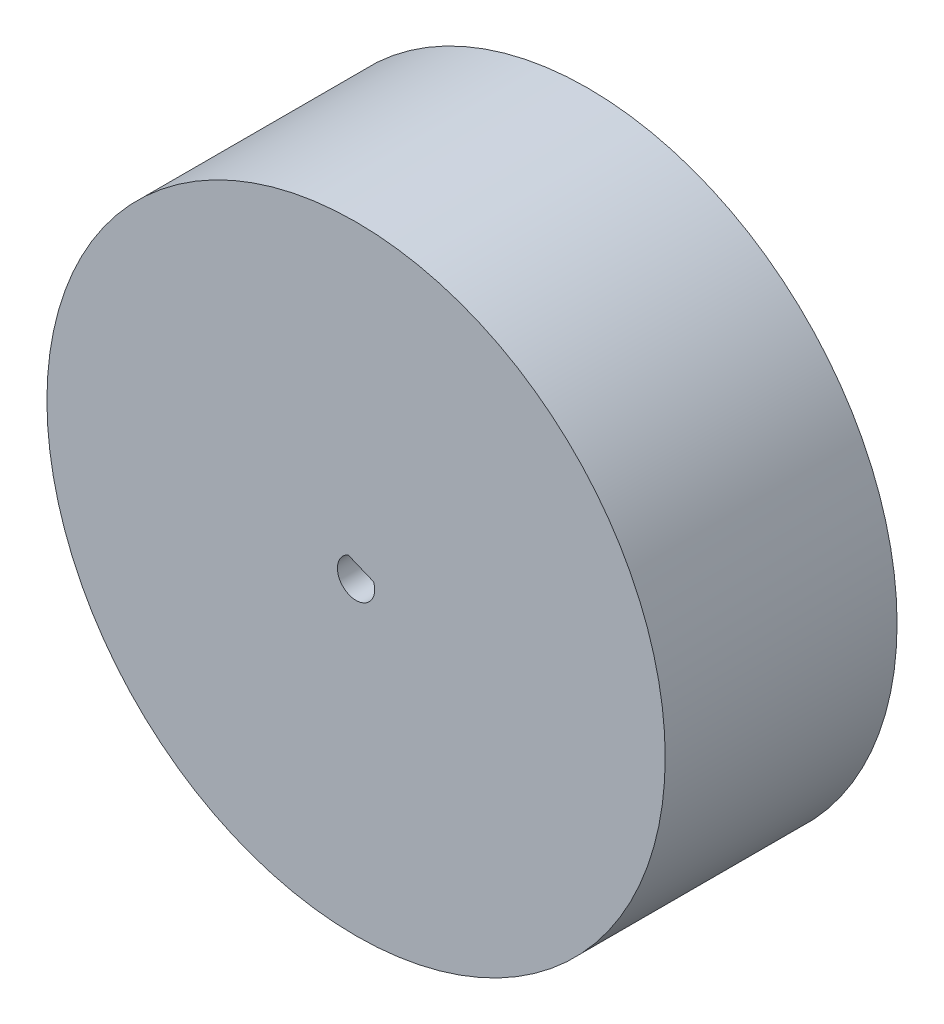
ISO-10303-21;
HEADER;
FILE_DESCRIPTION(('STEP AP214'),'2;1');
FILE_NAME('part.step','',(''),(''),'','','');
FILE_SCHEMA(('AUTOMOTIVE_DESIGN { 1 0 10303 214 1 1 1 1 }'));
ENDSEC;
DATA;
#1=APPLICATION_CONTEXT('core data for automotive mechanical design processes');
#2=APPLICATION_PROTOCOL_DEFINITION('international standard','automotive_design',2000,#1);
#3=PRODUCT_CONTEXT('',#1,'mechanical');
#4=PRODUCT('Part','Part','',(#3));
#5=PRODUCT_RELATED_PRODUCT_CATEGORY('part','',(#4));
#6=PRODUCT_DEFINITION_FORMATION('','',#4);
#7=PRODUCT_DEFINITION_CONTEXT('part definition',#1,'design');
#8=PRODUCT_DEFINITION('design','',#6,#7);
#9=PRODUCT_DEFINITION_SHAPE('','',#8);
#10=(LENGTH_UNIT() NAMED_UNIT(*) SI_UNIT(.MILLI.,.METRE.));
#11=(NAMED_UNIT(*) PLANE_ANGLE_UNIT() SI_UNIT($,.RADIAN.));
#12=(NAMED_UNIT(*) SI_UNIT($,.STERADIAN.) SOLID_ANGLE_UNIT());
#13=UNCERTAINTY_MEASURE_WITH_UNIT(LENGTH_MEASURE(1.E-05),#10,'distance_accuracy_value','');
#14=(GEOMETRIC_REPRESENTATION_CONTEXT(3) GLOBAL_UNCERTAINTY_ASSIGNED_CONTEXT((#13)) GLOBAL_UNIT_ASSIGNED_CONTEXT((#10,
#11,#12)) REPRESENTATION_CONTEXT('',''));
#15=CARTESIAN_POINT('',(0.,0.,0.));
#16=DIRECTION('',(0.,0.,1.));
#17=DIRECTION('',(1.,0.,0.));
#18=AXIS2_PLACEMENT_3D('',#15,#16,#17);
#19=CARTESIAN_POINT('',(0.,0.,-9.525));
#20=DIRECTION('',(0.,0.,1.));
#21=DIRECTION('',(1.,0.,0.));
#22=AXIS2_PLACEMENT_3D('',#19,#20,#21);
#23=CYLINDRICAL_SURFACE('',#22,25.4);
#24=CARTESIAN_POINT('',(0.,0.,-9.525));
#25=DIRECTION('',(0.,0.,1.));
#26=DIRECTION('',(1.,0.,0.));
#27=AXIS2_PLACEMENT_3D('',#24,#25,#26);
#28=CIRCLE('',#27,25.4);
#29=CARTESIAN_POINT('',(25.4,0.,-9.525));
#30=VERTEX_POINT('',#29);
#31=EDGE_CURVE('E11',#30,#30,#28,.T.);
#32=CARTESIAN_POINT('',(0.,0.,9.525));
#33=DIRECTION('',(0.,0.,1.));
#34=DIRECTION('',(1.,0.,0.));
#35=AXIS2_PLACEMENT_3D('',#32,#33,#34);
#36=CIRCLE('',#35,25.4);
#37=CARTESIAN_POINT('',(25.4,0.,9.525));
#38=VERTEX_POINT('',#37);
#39=EDGE_CURVE('E42',#38,#38,#36,.T.);
#40=CARTESIAN_POINT('',(25.4,0.,-9.525));
#41=CARTESIAN_POINT('',(25.4,0.,-9.3265625));
#42=CARTESIAN_POINT('',(25.4,0.,-9.128125));
#43=CARTESIAN_POINT('',(25.4,0.,-8.73125));
#44=CARTESIAN_POINT('',(25.4,0.,-8.5328125));
#45=CARTESIAN_POINT('',(25.4,0.,-8.1359375));
#46=CARTESIAN_POINT('',(25.4,0.,-7.9375));
#47=CARTESIAN_POINT('',(25.4,0.,-7.540625));
#48=CARTESIAN_POINT('',(25.4,0.,-7.3421875));
#49=CARTESIAN_POINT('',(25.4,0.,-6.9453125));
#50=CARTESIAN_POINT('',(25.4,0.,-6.746875));
#51=CARTESIAN_POINT('',(25.4,0.,-6.35));
#52=CARTESIAN_POINT('',(25.4,0.,-6.1515625));
#53=CARTESIAN_POINT('',(25.4,0.,-5.7546875));
#54=CARTESIAN_POINT('',(25.4,0.,-5.55625));
#55=CARTESIAN_POINT('',(25.4,0.,-5.159375));
#56=CARTESIAN_POINT('',(25.4,0.,-4.9609375));
#57=CARTESIAN_POINT('',(25.4,0.,-4.5640625));
#58=CARTESIAN_POINT('',(25.4,0.,-4.365625));
#59=CARTESIAN_POINT('',(25.4,0.,-3.96875));
#60=CARTESIAN_POINT('',(25.4,0.,-3.7703125));
#61=CARTESIAN_POINT('',(25.4,0.,-3.3734375));
#62=CARTESIAN_POINT('',(25.4,0.,-3.175));
#63=CARTESIAN_POINT('',(25.4,0.,-2.778125));
#64=CARTESIAN_POINT('',(25.4,0.,-2.5796875));
#65=CARTESIAN_POINT('',(25.4,0.,-2.1828125));
#66=CARTESIAN_POINT('',(25.4,0.,-1.984375));
#67=CARTESIAN_POINT('',(25.4,0.,-1.5875));
#68=CARTESIAN_POINT('',(25.4,0.,-1.3890625));
#69=CARTESIAN_POINT('',(25.4,0.,-0.992187500000002));
#70=CARTESIAN_POINT('',(25.4,0.,-0.793750000000002));
#71=CARTESIAN_POINT('',(25.4,0.,-0.396875000000002));
#72=CARTESIAN_POINT('',(25.4,0.,-0.198437500000002));
#73=CARTESIAN_POINT('',(25.4,0.,0.198437499999998));
#74=CARTESIAN_POINT('',(25.4,0.,0.396874999999998));
#75=CARTESIAN_POINT('',(25.4,0.,0.793749999999999));
#76=CARTESIAN_POINT('',(25.4,0.,0.992187499999999));
#77=CARTESIAN_POINT('',(25.4,0.,1.3890625));
#78=CARTESIAN_POINT('',(25.4,0.,1.5875));
#79=CARTESIAN_POINT('',(25.4,0.,1.984375));
#80=CARTESIAN_POINT('',(25.4,0.,2.1828125));
#81=CARTESIAN_POINT('',(25.4,0.,2.5796875));
#82=CARTESIAN_POINT('',(25.4,0.,2.778125));
#83=CARTESIAN_POINT('',(25.4,0.,3.175));
#84=CARTESIAN_POINT('',(25.4,0.,3.3734375));
#85=CARTESIAN_POINT('',(25.4,0.,3.7703125));
#86=CARTESIAN_POINT('',(25.4,0.,3.96875));
#87=CARTESIAN_POINT('',(25.4,0.,4.365625));
#88=CARTESIAN_POINT('',(25.4,0.,4.5640625));
#89=CARTESIAN_POINT('',(25.4,0.,4.9609375));
#90=CARTESIAN_POINT('',(25.4,0.,5.159375));
#91=CARTESIAN_POINT('',(25.4,0.,5.55625));
#92=CARTESIAN_POINT('',(25.4,0.,5.7546875));
#93=CARTESIAN_POINT('',(25.4,0.,6.1515625));
#94=CARTESIAN_POINT('',(25.4,0.,6.35));
#95=CARTESIAN_POINT('',(25.4,0.,6.746875));
#96=CARTESIAN_POINT('',(25.4,0.,6.9453125));
#97=CARTESIAN_POINT('',(25.4,0.,7.3421875));
#98=CARTESIAN_POINT('',(25.4,0.,7.540625));
#99=CARTESIAN_POINT('',(25.4,0.,7.9375));
#100=CARTESIAN_POINT('',(25.4,0.,8.1359375));
#101=CARTESIAN_POINT('',(25.4,0.,8.5328125));
#102=CARTESIAN_POINT('',(25.4,0.,8.73125));
#103=CARTESIAN_POINT('',(25.4,0.,9.128125));
#104=CARTESIAN_POINT('',(25.4,0.,9.3265625));
#105=CARTESIAN_POINT('',(25.4,0.,9.525));
#106=B_SPLINE_CURVE_WITH_KNOTS('',3,(#40,#41,#42,#43,#44,#45,#46,#47,#48,#49,#50,#51,#52,#53,
#54,#55,#56,#57,#58,#59,#60,#61,#62,#63,#64,#65,#66,#67,#68,#69,#70,#71,#72,#73,#74,#75,#76,#77,
#78,#79,#80,#81,#82,#83,#84,#85,#86,#87,#88,#89,#90,#91,#92,#93,#94,#95,#96,#97,#98,#99,#100,
#101,#102,#103,#104,#105),.UNSPECIFIED.,.F.,.F.,(4,2,2,2,2,2,2,2,2,2,2,2,2,2,2,2,2,2,2,2,2,2,2,
2,2,2,2,2,2,2,2,2,4),(0.,0.5953125,1.190625,1.7859375,2.38125,2.9765625,3.571875,4.1671875,
4.7625,5.3578125,5.953125,6.5484375,7.14375,7.7390625,8.334375,8.9296875,9.525,10.1203125,
10.715625,11.3109375,11.90625,12.5015625,13.096875,13.6921875,14.2875,14.8828125,15.478125,
16.0734375,16.66875,17.2640625,17.859375,18.4546875,19.05),.UNSPECIFIED.);
#107=EDGE_CURVE('BSEAM39',#30,#38,#106,.T.);
#108=ORIENTED_EDGE('',*,*,#31,.T.);
#109=ORIENTED_EDGE('',*,*,#39,.F.);
#110=ORIENTED_EDGE('',*,*,#107,.T.);
#111=ORIENTED_EDGE('',*,*,#107,.F.);
#112=EDGE_LOOP('',(#108,#110,#109,#111));
#113=FACE_BOUND('',#112,.T.);
#114=ADVANCED_FACE('F39',(#113),#23,.T.);
#115=CARTESIAN_POINT('',(0.,0.,-9.525));
#116=DIRECTION('',(0.,0.,1.));
#117=DIRECTION('',(1.,0.,0.));
#118=AXIS2_PLACEMENT_3D('',#115,#116,#117);
#119=PLANE('',#118);
#120=CARTESIAN_POINT('',(0.,0.,-9.525));
#121=DIRECTION('',(0.,0.,1.));
#122=DIRECTION('',(1.,0.,0.));
#123=AXIS2_PLACEMENT_3D('',#120,#121,#122);
#124=CIRCLE('',#123,1.53000000002459);
#125=CARTESIAN_POINT('',(-0.650538478304247,1.38481034380225,-9.525));
#126=VERTEX_POINT('',#125);
#127=CARTESIAN_POINT('',(1.43961943492041,0.518069380174786,-9.525));
#128=VERTEX_POINT('',#127);
#129=EDGE_CURVE('E78',#126,#128,#124,.T.);
#130=ORIENTED_EDGE('',*,*,#129,.T.);
#131=DIRECTION('',(-0.923728021347062,0.383049008063252,0.));
#132=VECTOR('',#131,1.);
#133=CARTESIAN_POINT('',(1.43961943491453,0.518069380172672,-9.525));
#134=LINE('',#133,#132);
#135=EDGE_CURVE('E53',#128,#126,#134,.T.);
#136=ORIENTED_EDGE('',*,*,#135,.T.);
#137=EDGE_LOOP('',(#130,#136));
#138=FACE_BOUND('',#137,.T.);
#139=ORIENTED_EDGE('',*,*,#31,.F.);
#140=EDGE_LOOP('',(#139));
#141=FACE_BOUND('',#140,.T.);
#142=ADVANCED_FACE('F87',(#138,#141),#119,.F.);
#143=CARTESIAN_POINT('',(0.,0.,9.525));
#144=DIRECTION('',(0.,0.,1.));
#145=DIRECTION('',(1.,0.,0.));
#146=AXIS2_PLACEMENT_3D('',#143,#144,#145);
#147=PLANE('',#146);
#148=DIRECTION('',(-0.923728021347064,0.383049008063248,0.));
#149=VECTOR('',#148,1.);
#150=CARTESIAN_POINT('',(-0.372765644224566,1.26962426510565,9.525));
#151=LINE('',#150,#149);
#152=CARTESIAN_POINT('',(1.43961943492041,0.518069380174786,9.525));
#153=VERTEX_POINT('',#152);
#154=CARTESIAN_POINT('',(-0.650538478306903,1.38481034380791,9.525));
#155=VERTEX_POINT('',#154);
#156=EDGE_CURVE('E58',#153,#155,#151,.T.);
#157=ORIENTED_EDGE('',*,*,#156,.F.);
#158=CARTESIAN_POINT('',(0.,0.,9.525));
#159=DIRECTION('',(0.,0.,1.));
#160=DIRECTION('',(1.,0.,0.));
#161=AXIS2_PLACEMENT_3D('',#158,#159,#160);
#162=CIRCLE('',#161,1.53000000002459);
#163=EDGE_CURVE('E72',#155,#153,#162,.T.);
#164=ORIENTED_EDGE('',*,*,#163,.F.);
#165=EDGE_LOOP('',(#157,#164));
#166=FACE_BOUND('',#165,.T.);
#167=ORIENTED_EDGE('',*,*,#39,.T.);
#168=EDGE_LOOP('',(#167));
#169=FACE_BOUND('',#168,.T.);
#170=ADVANCED_FACE('F76',(#166,#169),#147,.T.);
#171=CARTESIAN_POINT('',(-0.372765644224566,1.26962426510565,-9.525));
#172=DIRECTION('',(0.383049008063248,0.923728021347064,0.));
#173=DIRECTION('',(-0.923728021347064,0.383049008063248,0.));
#174=AXIS2_PLACEMENT_3D('',#171,#172,#173);
#175=PLANE('',#174);
#176=ORIENTED_EDGE('',*,*,#156,.T.);
#177=DIRECTION('',(0.,0.,1.));
#178=VECTOR('',#177,1.);
#179=CARTESIAN_POINT('',(-0.650538478304247,1.38481034380225,-9.525));
#180=LINE('',#179,#178);
#181=EDGE_CURVE('E69',#126,#155,#180,.T.);
#182=ORIENTED_EDGE('',*,*,#181,.F.);
#183=ORIENTED_EDGE('',*,*,#135,.F.);
#184=DIRECTION('',(0.,0.,1.));
#185=VECTOR('',#184,1.);
#186=CARTESIAN_POINT('',(1.43961943492041,0.518069380174786,-9.525));
#187=LINE('',#186,#185);
#188=EDGE_CURVE('E63',#128,#153,#187,.T.);
#189=ORIENTED_EDGE('',*,*,#188,.T.);
#190=EDGE_LOOP('',(#176,#182,#183,#189));
#191=FACE_BOUND('',#190,.T.);
#192=ADVANCED_FACE('F65',(#191),#175,.F.);
#193=CARTESIAN_POINT('',(0.,0.,-9.525));
#194=DIRECTION('',(0.,0.,1.));
#195=DIRECTION('',(1.,0.,0.));
#196=AXIS2_PLACEMENT_3D('',#193,#194,#195);
#197=CYLINDRICAL_SURFACE('',#196,1.53000000002459);
#198=ORIENTED_EDGE('',*,*,#163,.T.);
#199=ORIENTED_EDGE('',*,*,#188,.F.);
#200=ORIENTED_EDGE('',*,*,#129,.F.);
#201=ORIENTED_EDGE('',*,*,#181,.T.);
#202=EDGE_LOOP('',(#198,#199,#200,#201));
#203=FACE_BOUND('',#202,.T.);
#204=ADVANCED_FACE('F73',(#203),#197,.F.);
#205=CLOSED_SHELL('',(#114,#142,#170,#192,#204));
#206=MANIFOLD_SOLID_BREP('B2',#205);
#207=ADVANCED_BREP_SHAPE_REPRESENTATION('',(#18,#206),#14);
#208=SHAPE_DEFINITION_REPRESENTATION(#9,#207);
ENDSEC;
END-ISO-10303-21;
